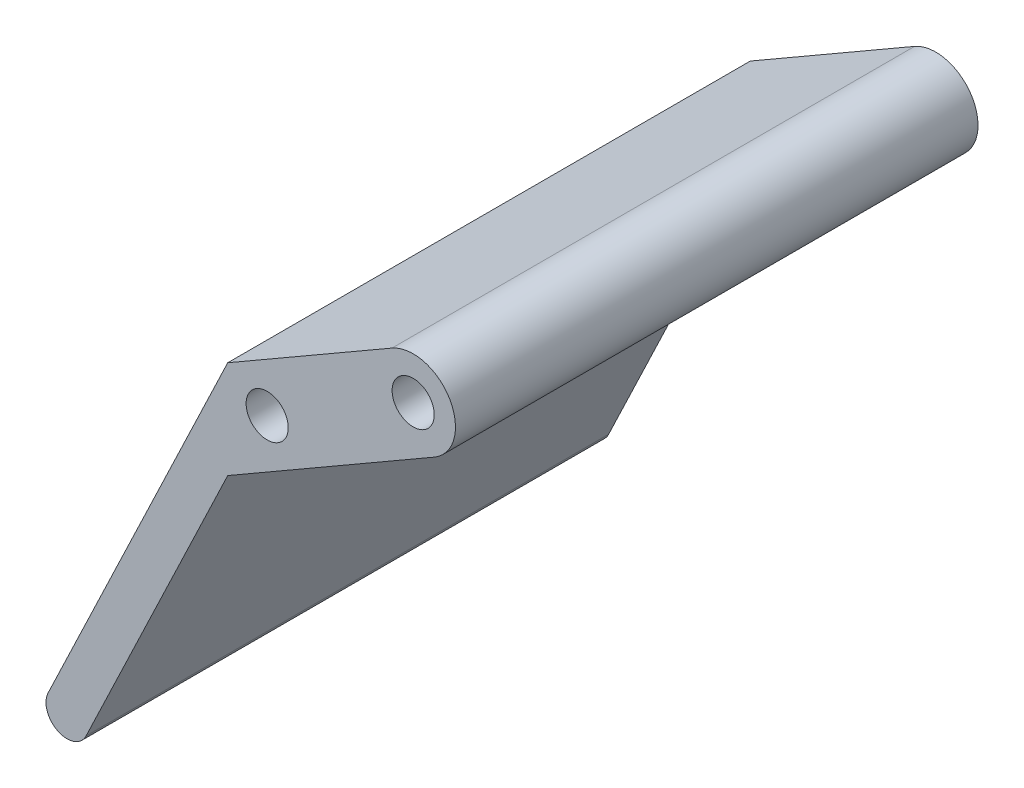
ISO-10303-21;
HEADER;
FILE_DESCRIPTION(('STEP AP214'),'2;1');
FILE_NAME('part.step','',(''),(''),'','','');
FILE_SCHEMA(('AUTOMOTIVE_DESIGN { 1 0 10303 214 1 1 1 1 }'));
ENDSEC;
DATA;
#1=APPLICATION_CONTEXT('core data for automotive mechanical design processes');
#2=APPLICATION_PROTOCOL_DEFINITION('international standard','automotive_design',2000,#1);
#3=PRODUCT_CONTEXT('',#1,'mechanical');
#4=PRODUCT('Part','Part','',(#3));
#5=PRODUCT_RELATED_PRODUCT_CATEGORY('part','',(#4));
#6=PRODUCT_DEFINITION_FORMATION('','',#4);
#7=PRODUCT_DEFINITION_CONTEXT('part definition',#1,'design');
#8=PRODUCT_DEFINITION('design','',#6,#7);
#9=PRODUCT_DEFINITION_SHAPE('','',#8);
#10=(LENGTH_UNIT() NAMED_UNIT(*) SI_UNIT(.MILLI.,.METRE.));
#11=(NAMED_UNIT(*) PLANE_ANGLE_UNIT() SI_UNIT($,.RADIAN.));
#12=(NAMED_UNIT(*) SI_UNIT($,.STERADIAN.) SOLID_ANGLE_UNIT());
#13=UNCERTAINTY_MEASURE_WITH_UNIT(LENGTH_MEASURE(1.E-05),#10,'distance_accuracy_value','');
#14=(GEOMETRIC_REPRESENTATION_CONTEXT(3) GLOBAL_UNCERTAINTY_ASSIGNED_CONTEXT((#13)) GLOBAL_UNIT_ASSIGNED_CONTEXT((#10,
#11,#12)) REPRESENTATION_CONTEXT('',''));
#15=CARTESIAN_POINT('',(0.,0.,0.));
#16=DIRECTION('',(0.,0.,1.));
#17=DIRECTION('',(1.,0.,0.));
#18=AXIS2_PLACEMENT_3D('',#15,#16,#17);
#19=CARTESIAN_POINT('',(7.,64.4114817289327,70.));
#20=DIRECTION('',(0.,0.,-1.));
#21=DIRECTION('',(0.,1.,0.));
#22=AXIS2_PLACEMENT_3D('',#19,#20,#21);
#23=CYLINDRICAL_SURFACE('',#22,2.5);
#24=CARTESIAN_POINT('',(7.,64.4114817289327,65.));
#25=DIRECTION('',(0.,0.,-1.));
#26=DIRECTION('',(0.,1.,0.));
#27=AXIS2_PLACEMENT_3D('',#24,#25,#26);
#28=CIRCLE('',#27,2.5);
#29=CARTESIAN_POINT('',(7.,66.9114817289327,65.));
#30=VERTEX_POINT('',#29);
#31=EDGE_CURVE('E109',#30,#30,#28,.F.);
#32=ORIENTED_EDGE('',*,*,#31,.T.);
#33=EDGE_LOOP('',(#32));
#34=FACE_BOUND('',#33,.T.);
#35=CARTESIAN_POINT('',(7.,64.4114817289327,3.00000000000001));
#36=DIRECTION('',(0.,0.,-1.));
#37=DIRECTION('',(0.,1.,0.));
#38=AXIS2_PLACEMENT_3D('',#35,#36,#37);
#39=CIRCLE('',#38,2.5);
#40=CARTESIAN_POINT('',(7.,66.9114817289327,3.00000000000001));
#41=VERTEX_POINT('',#40);
#42=EDGE_CURVE('E189',#41,#41,#39,.F.);
#43=ORIENTED_EDGE('',*,*,#42,.F.);
#44=EDGE_LOOP('',(#43));
#45=FACE_BOUND('',#44,.T.);
#46=ADVANCED_FACE('F105',(#34,#45),#23,.F.);
#47=CARTESIAN_POINT('',(-10.3205080756888,54.4114817289327,70.));
#48=DIRECTION('',(0.,0.,-1.));
#49=DIRECTION('',(0.,1.,0.));
#50=AXIS2_PLACEMENT_3D('',#47,#48,#49);
#51=CYLINDRICAL_SURFACE('',#50,2.5);
#52=CARTESIAN_POINT('',(-10.3205080756888,54.4114817289327,65.));
#53=DIRECTION('',(0.,0.,-1.));
#54=DIRECTION('',(0.,1.,0.));
#55=AXIS2_PLACEMENT_3D('',#52,#53,#54);
#56=CIRCLE('',#55,2.5);
#57=CARTESIAN_POINT('',(-10.3205080756888,56.9114817289327,65.));
#58=VERTEX_POINT('',#57);
#59=EDGE_CURVE('E200',#58,#58,#56,.F.);
#60=ORIENTED_EDGE('',*,*,#59,.T.);
#61=EDGE_LOOP('',(#60));
#62=FACE_BOUND('',#61,.T.);
#63=CARTESIAN_POINT('',(-10.3205080756888,54.4114817289327,3.00000000000001));
#64=DIRECTION('',(0.,0.,-1.));
#65=DIRECTION('',(0.,1.,0.));
#66=AXIS2_PLACEMENT_3D('',#63,#64,#65);
#67=CIRCLE('',#66,2.5);
#68=CARTESIAN_POINT('',(-10.3205080756888,56.9114817289327,3.00000000000001));
#69=VERTEX_POINT('',#68);
#70=EDGE_CURVE('E186',#69,#69,#67,.F.);
#71=ORIENTED_EDGE('',*,*,#70,.F.);
#72=EDGE_LOOP('',(#71));
#73=FACE_BOUND('',#72,.T.);
#74=ADVANCED_FACE('F233',(#62,#73),#51,.F.);
#75=CARTESIAN_POINT('',(-34.0638083880123,11.8330741849716,65.));
#76=DIRECTION('',(0.,0.,-1.));
#77=DIRECTION('',(0.,1.,0.));
#78=AXIS2_PLACEMENT_3D('',#75,#76,#77);
#79=PLANE('',#78);
#80=DIRECTION('',(-0.43131449185541,-0.902201645484816,0.));
#81=VECTOR('',#80,1.);
#82=CARTESIAN_POINT('',(-15.,45.9135411631125,65.));
#83=LINE('',#82,#81);
#84=CARTESIAN_POINT('',(-15.,45.9135411631125,65.));
#85=VERTEX_POINT('',#84);
#86=CARTESIAN_POINT('',(-31.8083042743003,10.7547879553331,65.));
#87=VERTEX_POINT('',#86);
#88=EDGE_CURVE('E169',#85,#87,#83,.T.);
#89=ORIENTED_EDGE('',*,*,#88,.F.);
#90=DIRECTION('',(-0.86602540378444,-0.499999999999998,0.));
#91=VECTOR('',#90,1.);
#92=CARTESIAN_POINT('',(9.50984322384754,60.0643057461963,65.));
#93=LINE('',#92,#91);
#94=CARTESIAN_POINT('',(9.50984322384754,60.0643057461963,65.));
#95=VERTEX_POINT('',#94);
#96=EDGE_CURVE('E168',#95,#85,#93,.T.);
#97=ORIENTED_EDGE('',*,*,#96,.F.);
#98=CARTESIAN_POINT('',(7.,64.4114817289327,65.));
#99=DIRECTION('',(0.,0.,-1.));
#100=DIRECTION('',(0.,1.,0.));
#101=AXIS2_PLACEMENT_3D('',#98,#99,#100);
#102=CIRCLE('',#101,5.0196864476951);
#103=CARTESIAN_POINT('',(4.49015677615246,68.7586577116692,65.));
#104=VERTEX_POINT('',#103);
#105=EDGE_CURVE('E114',#104,#95,#102,.T.);
#106=ORIENTED_EDGE('',*,*,#105,.F.);
#107=DIRECTION('',(-0.86602540378444,-0.499999999999997,0.));
#108=VECTOR('',#107,1.);
#109=CARTESIAN_POINT('',(4.49015677615246,68.7586577116692,65.));
#110=LINE('',#109,#108);
#111=CARTESIAN_POINT('',(-15.,57.5060104504096,65.));
#112=VERTEX_POINT('',#111);
#113=EDGE_CURVE('E121',#104,#112,#110,.T.);
#114=ORIENTED_EDGE('',*,*,#113,.T.);
#115=DIRECTION('',(-0.43131449185541,-0.902201645484816,0.));
#116=VECTOR('',#115,1.);
#117=CARTESIAN_POINT('',(-15.,57.5060104504096,65.));
#118=LINE('',#117,#116);
#119=CARTESIAN_POINT('',(-36.3193125017243,12.9113604146102,65.));
#120=VERTEX_POINT('',#119);
#121=EDGE_CURVE('E209',#112,#120,#118,.T.);
#122=ORIENTED_EDGE('',*,*,#121,.T.);
#123=CARTESIAN_POINT('',(-34.0638083880123,11.8330741849716,65.));
#124=DIRECTION('',(0.,0.,-1.));
#125=DIRECTION('',(0.,1.,0.));
#126=AXIS2_PLACEMENT_3D('',#123,#124,#125);
#127=CIRCLE('',#126,2.5);
#128=EDGE_CURVE('E207',#87,#120,#127,.T.);
#129=ORIENTED_EDGE('',*,*,#128,.F.);
#130=EDGE_LOOP('',(#89,#97,#106,#114,#122,#129));
#131=FACE_BOUND('',#130,.T.);
#132=ORIENTED_EDGE('',*,*,#59,.F.);
#133=EDGE_LOOP('',(#132));
#134=FACE_BOUND('',#133,.T.);
#135=ORIENTED_EDGE('',*,*,#31,.F.);
#136=EDGE_LOOP('',(#135));
#137=FACE_BOUND('',#136,.T.);
#138=ADVANCED_FACE('F221',(#131,#134,#137),#79,.F.);
#139=CARTESIAN_POINT('',(-15.,57.5060104504096,-72.2796019133196));
#140=DIRECTION('',(-0.902201645484816,0.43131449185541,0.));
#141=DIRECTION('',(-0.43131449185541,-0.902201645484816,0.));
#142=AXIS2_PLACEMENT_3D('',#139,#140,#141);
#143=PLANE('',#142);
#144=DIRECTION('',(0.,0.,1.));
#145=VECTOR('',#144,1.);
#146=CARTESIAN_POINT('',(-15.,57.5060104504096,-72.2796019133196));
#147=LINE('',#146,#145);
#148=CARTESIAN_POINT('',(-15.,57.5060104504096,3.00000000000001));
#149=VERTEX_POINT('',#148);
#150=EDGE_CURVE('E12',#149,#112,#147,.T.);
#151=ORIENTED_EDGE('',*,*,#150,.F.);
#152=DIRECTION('',(0.43131449185541,0.902201645484816,0.));
#153=VECTOR('',#152,1.);
#154=CARTESIAN_POINT('',(-36.3193125017243,12.9113604146102,3.00000000000002));
#155=LINE('',#154,#153);
#156=CARTESIAN_POINT('',(-36.3193125017243,12.9113604146102,3.00000000000002));
#157=VERTEX_POINT('',#156);
#158=EDGE_CURVE('E197',#157,#149,#155,.T.);
#159=ORIENTED_EDGE('',*,*,#158,.F.);
#160=DIRECTION('',(0.,0.,1.));
#161=VECTOR('',#160,1.);
#162=CARTESIAN_POINT('',(-36.3193125017243,12.9113604146101,-72.2796019133196));
#163=LINE('',#162,#161);
#164=EDGE_CURVE('E211',#157,#120,#163,.T.);
#165=ORIENTED_EDGE('',*,*,#164,.T.);
#166=ORIENTED_EDGE('',*,*,#121,.F.);
#167=EDGE_LOOP('',(#151,#159,#165,#166));
#168=FACE_BOUND('',#167,.T.);
#169=ADVANCED_FACE('F107',(#168),#143,.T.);
#170=CARTESIAN_POINT('',(-34.0638083880123,11.8330741849716,-72.2796019133196));
#171=DIRECTION('',(0.,0.,1.));
#172=DIRECTION('',(0.,-1.,0.));
#173=AXIS2_PLACEMENT_3D('',#170,#171,#172);
#174=CYLINDRICAL_SURFACE('',#173,2.5);
#175=ORIENTED_EDGE('',*,*,#164,.F.);
#176=CARTESIAN_POINT('',(-34.0638083880123,11.8330741849716,3.00000000000002));
#177=DIRECTION('',(0.,0.,-1.));
#178=DIRECTION('',(0.,1.,0.));
#179=AXIS2_PLACEMENT_3D('',#176,#177,#178);
#180=CIRCLE('',#179,2.5);
#181=CARTESIAN_POINT('',(-31.8083042743003,10.7547879553331,3.00000000000002));
#182=VERTEX_POINT('',#181);
#183=EDGE_CURVE('E194',#182,#157,#180,.T.);
#184=ORIENTED_EDGE('',*,*,#183,.F.);
#185=DIRECTION('',(0.,0.,1.));
#186=VECTOR('',#185,1.);
#187=CARTESIAN_POINT('',(-31.8083042743003,10.7547879553331,-72.2796019133196));
#188=LINE('',#187,#186);
#189=EDGE_CURVE('E129',#182,#87,#188,.T.);
#190=ORIENTED_EDGE('',*,*,#189,.T.);
#191=ORIENTED_EDGE('',*,*,#128,.T.);
#192=EDGE_LOOP('',(#175,#184,#190,#191));
#193=FACE_BOUND('',#192,.T.);
#194=ADVANCED_FACE('F223',(#193),#174,.T.);
#195=CARTESIAN_POINT('',(-15.,45.9135411631124,-72.2796019133196));
#196=DIRECTION('',(-0.902201645484816,0.43131449185541,0.));
#197=DIRECTION('',(-0.431314491855411,-0.902201645484816,0.));
#198=AXIS2_PLACEMENT_3D('',#195,#196,#197);
#199=PLANE('',#198);
#200=ORIENTED_EDGE('',*,*,#189,.F.);
#201=DIRECTION('',(-0.431314491855411,-0.902201645484816,0.));
#202=VECTOR('',#201,1.);
#203=CARTESIAN_POINT('',(-15.,45.9135411631125,3.00000000000001));
#204=LINE('',#203,#202);
#205=CARTESIAN_POINT('',(-15.,45.9135411631125,3.00000000000001));
#206=VERTEX_POINT('',#205);
#207=EDGE_CURVE('E179',#206,#182,#204,.T.);
#208=ORIENTED_EDGE('',*,*,#207,.F.);
#209=DIRECTION('',(0.,0.,1.));
#210=VECTOR('',#209,1.);
#211=CARTESIAN_POINT('',(-15.,45.9135411631124,-72.2796019133196));
#212=LINE('',#211,#210);
#213=EDGE_CURVE('E175',#206,#85,#212,.T.);
#214=ORIENTED_EDGE('',*,*,#213,.T.);
#215=ORIENTED_EDGE('',*,*,#88,.T.);
#216=EDGE_LOOP('',(#200,#208,#214,#215));
#217=FACE_BOUND('',#216,.T.);
#218=ADVANCED_FACE('F225',(#217),#199,.F.);
#219=CARTESIAN_POINT('',(9.50984322384754,60.0643057461963,-72.2796019133196));
#220=DIRECTION('',(-0.499999999999998,0.86602540378444,0.));
#221=DIRECTION('',(-0.86602540378444,-0.499999999999998,0.));
#222=AXIS2_PLACEMENT_3D('',#219,#220,#221);
#223=PLANE('',#222);
#224=ORIENTED_EDGE('',*,*,#213,.F.);
#225=DIRECTION('',(-0.86602540378444,-0.499999999999998,0.));
#226=VECTOR('',#225,1.);
#227=CARTESIAN_POINT('',(9.50984322384754,60.0643057461963,3.00000000000001));
#228=LINE('',#227,#226);
#229=CARTESIAN_POINT('',(9.50984322384754,60.0643057461963,3.00000000000001));
#230=VERTEX_POINT('',#229);
#231=EDGE_CURVE('E172',#230,#206,#228,.T.);
#232=ORIENTED_EDGE('',*,*,#231,.F.);
#233=DIRECTION('',(0.,0.,1.));
#234=VECTOR('',#233,1.);
#235=CARTESIAN_POINT('',(9.50984322384754,60.0643057461963,-72.2796019133196));
#236=LINE('',#235,#234);
#237=EDGE_CURVE('E160',#230,#95,#236,.T.);
#238=ORIENTED_EDGE('',*,*,#237,.T.);
#239=ORIENTED_EDGE('',*,*,#96,.T.);
#240=EDGE_LOOP('',(#224,#232,#238,#239));
#241=FACE_BOUND('',#240,.T.);
#242=ADVANCED_FACE('F173',(#241),#223,.F.);
#243=CARTESIAN_POINT('',(7.,64.4114817289327,-72.2796019133196));
#244=DIRECTION('',(0.,0.,1.));
#245=DIRECTION('',(0.,-1.,0.));
#246=AXIS2_PLACEMENT_3D('',#243,#244,#245);
#247=CYLINDRICAL_SURFACE('',#246,5.0196864476951);
#248=ORIENTED_EDGE('',*,*,#237,.F.);
#249=CARTESIAN_POINT('',(7.,64.4114817289327,3.00000000000001));
#250=DIRECTION('',(0.,0.,-1.));
#251=DIRECTION('',(0.,1.,0.));
#252=AXIS2_PLACEMENT_3D('',#249,#250,#251);
#253=CIRCLE('',#252,5.0196864476951);
#254=CARTESIAN_POINT('',(4.49015677615246,68.7586577116691,3.00000000000001));
#255=VERTEX_POINT('',#254);
#256=EDGE_CURVE('E165',#255,#230,#253,.T.);
#257=ORIENTED_EDGE('',*,*,#256,.F.);
#258=DIRECTION('',(0.,0.,1.));
#259=VECTOR('',#258,1.);
#260=CARTESIAN_POINT('',(4.49015677615246,68.7586577116691,-72.2796019133196));
#261=LINE('',#260,#259);
#262=EDGE_CURVE('E204',#255,#104,#261,.T.);
#263=ORIENTED_EDGE('',*,*,#262,.T.);
#264=ORIENTED_EDGE('',*,*,#105,.T.);
#265=EDGE_LOOP('',(#248,#257,#263,#264));
#266=FACE_BOUND('',#265,.T.);
#267=ADVANCED_FACE('F162',(#266),#247,.T.);
#268=CARTESIAN_POINT('',(4.49015677615246,68.7586577116691,-72.2796019133196));
#269=DIRECTION('',(-0.499999999999997,0.86602540378444,0.));
#270=DIRECTION('',(-0.86602540378444,-0.499999999999997,0.));
#271=AXIS2_PLACEMENT_3D('',#268,#269,#270);
#272=PLANE('',#271);
#273=ORIENTED_EDGE('',*,*,#262,.F.);
#274=DIRECTION('',(0.86602540378444,0.499999999999997,0.));
#275=VECTOR('',#274,1.);
#276=CARTESIAN_POINT('',(-15.,57.5060104504096,3.00000000000001));
#277=LINE('',#276,#275);
#278=EDGE_CURVE('E185',#149,#255,#277,.T.);
#279=ORIENTED_EDGE('',*,*,#278,.F.);
#280=ORIENTED_EDGE('',*,*,#150,.T.);
#281=ORIENTED_EDGE('',*,*,#113,.F.);
#282=EDGE_LOOP('',(#273,#279,#280,#281));
#283=FACE_BOUND('',#282,.T.);
#284=ADVANCED_FACE('F247',(#283),#272,.T.);
#285=CARTESIAN_POINT('',(7.,64.4114817289327,3.00000000000001));
#286=DIRECTION('',(0.,0.,-1.));
#287=DIRECTION('',(0.,1.,0.));
#288=AXIS2_PLACEMENT_3D('',#285,#286,#287);
#289=PLANE('',#288);
#290=ORIENTED_EDGE('',*,*,#42,.T.);
#291=EDGE_LOOP('',(#290));
#292=FACE_BOUND('',#291,.T.);
#293=ORIENTED_EDGE('',*,*,#70,.T.);
#294=EDGE_LOOP('',(#293));
#295=FACE_BOUND('',#294,.T.);
#296=ORIENTED_EDGE('',*,*,#256,.T.);
#297=ORIENTED_EDGE('',*,*,#231,.T.);
#298=ORIENTED_EDGE('',*,*,#207,.T.);
#299=ORIENTED_EDGE('',*,*,#183,.T.);
#300=ORIENTED_EDGE('',*,*,#158,.T.);
#301=ORIENTED_EDGE('',*,*,#278,.T.);
#302=EDGE_LOOP('',(#296,#297,#298,#299,#300,#301));
#303=FACE_BOUND('',#302,.T.);
#304=ADVANCED_FACE('F182',(#292,#295,#303),#289,.T.);
#305=CLOSED_SHELL('',(#46,#74,#138,#169,#194,#218,#242,#267,#284,#304));
#306=MANIFOLD_SOLID_BREP('B2',#305);
#307=ADVANCED_BREP_SHAPE_REPRESENTATION('',(#18,#306),#14);
#308=SHAPE_DEFINITION_REPRESENTATION(#9,#307);
ENDSEC;
END-ISO-10303-21;
